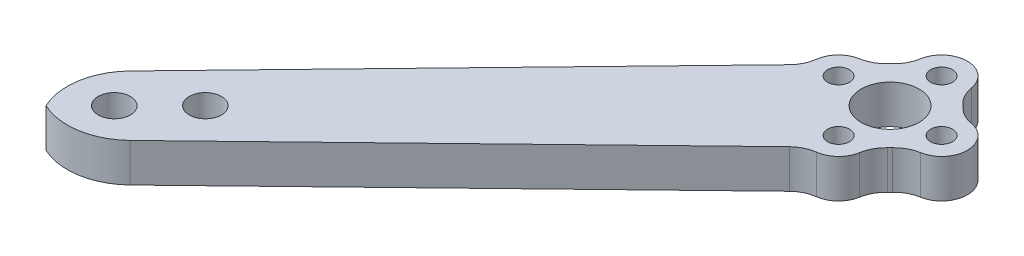
ISO-10303-21;
HEADER;
FILE_DESCRIPTION(('STEP AP214'),'2;1');
FILE_NAME('part.step','',(''),(''),'','','');
FILE_SCHEMA(('AUTOMOTIVE_DESIGN { 1 0 10303 214 1 1 1 1 }'));
ENDSEC;
DATA;
#1=APPLICATION_CONTEXT('core data for automotive mechanical design processes');
#2=APPLICATION_PROTOCOL_DEFINITION('international standard','automotive_design',2000,#1);
#3=PRODUCT_CONTEXT('',#1,'mechanical');
#4=PRODUCT('Part','Part','',(#3));
#5=PRODUCT_RELATED_PRODUCT_CATEGORY('part','',(#4));
#6=PRODUCT_DEFINITION_FORMATION('','',#4);
#7=PRODUCT_DEFINITION_CONTEXT('part definition',#1,'design');
#8=PRODUCT_DEFINITION('design','',#6,#7);
#9=PRODUCT_DEFINITION_SHAPE('','',#8);
#10=(LENGTH_UNIT() NAMED_UNIT(*) SI_UNIT(.MILLI.,.METRE.));
#11=(NAMED_UNIT(*) PLANE_ANGLE_UNIT() SI_UNIT($,.RADIAN.));
#12=(NAMED_UNIT(*) SI_UNIT($,.STERADIAN.) SOLID_ANGLE_UNIT());
#13=UNCERTAINTY_MEASURE_WITH_UNIT(LENGTH_MEASURE(1.E-05),#10,'distance_accuracy_value','');
#14=(GEOMETRIC_REPRESENTATION_CONTEXT(3) GLOBAL_UNCERTAINTY_ASSIGNED_CONTEXT((#13)) GLOBAL_UNIT_ASSIGNED_CONTEXT((#10,
#11,#12)) REPRESENTATION_CONTEXT('',''));
#15=CARTESIAN_POINT('',(0.,0.,0.));
#16=DIRECTION('',(0.,0.,1.));
#17=DIRECTION('',(1.,0.,0.));
#18=AXIS2_PLACEMENT_3D('',#15,#16,#17);
#19=CARTESIAN_POINT('',(94.5,6.,-93.8741196746495));
#20=DIRECTION('',(0.,-1.,0.));
#21=DIRECTION('',(0.,0.,-1.));
#22=AXIS2_PLACEMENT_3D('',#19,#20,#21);
#23=PLANE('',#22);
#24=CARTESIAN_POINT('',(24.7487373415292,6.,-24.7487373415292));
#25=DIRECTION('',(0.,1.,0.));
#26=DIRECTION('',(0.,0.,1.));
#27=AXIS2_PLACEMENT_3D('',#24,#25,#26);
#28=CIRCLE('',#27,2.5);
#29=CARTESIAN_POINT('',(24.7487373415292,6.,-22.2487373415292));
#30=VERTEX_POINT('',#29);
#31=EDGE_CURVE('E235',#30,#30,#28,.T.);
#32=ORIENTED_EDGE('',*,*,#31,.F.);
#33=EDGE_LOOP('',(#32));
#34=FACE_BOUND('',#33,.T.);
#35=CARTESIAN_POINT('',(31.8198051533946,6.,-31.8198051533946));
#36=DIRECTION('',(0.,1.,0.));
#37=DIRECTION('',(0.,0.,1.));
#38=AXIS2_PLACEMENT_3D('',#35,#36,#37);
#39=CIRCLE('',#38,2.5);
#40=CARTESIAN_POINT('',(31.8198051533946,6.,-29.3198051533946));
#41=VERTEX_POINT('',#40);
#42=EDGE_CURVE('E242',#41,#41,#39,.T.);
#43=ORIENTED_EDGE('',*,*,#42,.F.);
#44=EDGE_LOOP('',(#43));
#45=FACE_BOUND('',#44,.T.);
#46=CARTESIAN_POINT('',(28.4945148623447,6.,-23.6962252841413));
#47=DIRECTION('',(0.,-1.,0.));
#48=DIRECTION('',(0.,0.,-1.));
#49=AXIS2_PLACEMENT_3D('',#46,#47,#48);
#50=CIRCLE('',#49,10.);
#51=CARTESIAN_POINT('',(21.3078406424468,6.,-30.6497649336331));
#52=VERTEX_POINT('',#51);
#53=CARTESIAN_POINT('',(19.4437458895595,6.,-19.4437458895683));
#54=VERTEX_POINT('',#53);
#55=EDGE_CURVE('E65',#52,#54,#50,.F.);
#56=ORIENTED_EDGE('',*,*,#55,.T.);
#57=CARTESIAN_POINT('',(23.6962252841324,6.,-28.4945148623536));
#58=DIRECTION('',(0.,-1.,0.));
#59=DIRECTION('',(0.,0.,-1.));
#60=AXIS2_PLACEMENT_3D('',#57,#58,#59);
#61=CIRCLE('',#60,10.);
#62=CARTESIAN_POINT('',(30.6497649336229,6.,-21.3078406424544));
#63=VERTEX_POINT('',#62);
#64=EDGE_CURVE('E57',#54,#63,#61,.F.);
#65=ORIENTED_EDGE('',*,*,#64,.T.);
#66=DIRECTION('',(0.71866742198992,0.,-0.695353964949048));
#67=VECTOR('',#66,1.);
#68=CARTESIAN_POINT('',(82.7012290940619,6.,-71.6707635715978));
#69=LINE('',#68,#67);
#70=CARTESIAN_POINT('',(82.7012290940617,6.,-71.6707635715979));
#71=VERTEX_POINT('',#70);
#72=EDGE_CURVE('E312',#63,#71,#69,.T.);
#73=ORIENTED_EDGE('',*,*,#72,.T.);
#74=CARTESIAN_POINT('',(86.1779989188068,6.,-68.0774264616485));
#75=DIRECTION('',(0.,-1.,0.));
#76=DIRECTION('',(0.,0.,1.));
#77=AXIS2_PLACEMENT_3D('',#74,#75,#76);
#78=CIRCLE('',#77,4.99999999999975);
#79=CARTESIAN_POINT('',(85.5235550750253,6.,-73.0344117607327));
#80=VERTEX_POINT('',#79);
#81=EDGE_CURVE('E315',#71,#80,#78,.T.);
#82=ORIENTED_EDGE('',*,*,#81,.T.);
#83=CARTESIAN_POINT('',(85.,6.,-77.));
#84=DIRECTION('',(0.,1.,0.));
#85=DIRECTION('',(0.,0.,1.));
#86=AXIS2_PLACEMENT_3D('',#83,#84,#85);
#87=CIRCLE('',#86,4.00000000000002);
#88=CARTESIAN_POINT('',(88.9440531887331,6.,-76.3333333333334));
#89=VERTEX_POINT('',#88);
#90=EDGE_CURVE('E318',#80,#89,#87,.T.);
#91=ORIENTED_EDGE('',*,*,#90,.T.);
#92=CARTESIAN_POINT('',(93.8741196746494,6.,-75.5));
#93=DIRECTION('',(0.,-1.,0.));
#94=DIRECTION('',(0.,0.,1.));
#95=AXIS2_PLACEMENT_3D('',#92,#93,#94);
#96=CIRCLE('',#95,5.);
#97=CARTESIAN_POINT('',(90.4609967228612,6.,-79.1538461538462));
#98=VERTEX_POINT('',#97);
#99=EDGE_CURVE('E321',#89,#98,#96,.T.);
#100=ORIENTED_EDGE('',*,*,#99,.T.);
#101=CARTESIAN_POINT('',(85.,6.,-85.));
#102=DIRECTION('',(0.,1.,0.));
#103=DIRECTION('',(0.,0.,1.));
#104=AXIS2_PLACEMENT_3D('',#101,#102,#103);
#105=CIRCLE('',#104,8.);
#106=CARTESIAN_POINT('',(90.8461538461538,6.,-79.5390032771388));
#107=VERTEX_POINT('',#106);
#108=EDGE_CURVE('E324',#98,#107,#105,.T.);
#109=ORIENTED_EDGE('',*,*,#108,.T.);
#110=CARTESIAN_POINT('',(94.5,6.,-76.1258803253506));
#111=DIRECTION('',(0.,-1.,0.));
#112=DIRECTION('',(0.,0.,1.));
#113=AXIS2_PLACEMENT_3D('',#110,#111,#112);
#114=CIRCLE('',#113,5.);
#115=CARTESIAN_POINT('',(93.6666666666667,6.,-81.0559468112669));
#116=VERTEX_POINT('',#115);
#117=EDGE_CURVE('E327',#107,#116,#114,.T.);
#118=ORIENTED_EDGE('',*,*,#117,.T.);
#119=CARTESIAN_POINT('',(93.,6.,-85.));
#120=DIRECTION('',(0.,1.,0.));
#121=DIRECTION('',(0.,0.,1.));
#122=AXIS2_PLACEMENT_3D('',#119,#120,#121);
#123=CIRCLE('',#122,4.00000000000001);
#124=CARTESIAN_POINT('',(93.6666666666667,6.,-88.9440531887331));
#125=VERTEX_POINT('',#124);
#126=EDGE_CURVE('E197',#116,#125,#123,.T.);
#127=ORIENTED_EDGE('',*,*,#126,.T.);
#128=CARTESIAN_POINT('',(94.5,6.,-93.8741196746495));
#129=DIRECTION('',(0.,-1.,0.));
#130=DIRECTION('',(0.,0.,-1.));
#131=AXIS2_PLACEMENT_3D('',#128,#129,#130);
#132=CIRCLE('',#131,5.);
#133=CARTESIAN_POINT('',(90.8461538461539,6.,-90.4609967228612));
#134=VERTEX_POINT('',#133);
#135=EDGE_CURVE('E192',#125,#134,#132,.T.);
#136=ORIENTED_EDGE('',*,*,#135,.T.);
#137=CARTESIAN_POINT('',(85.,6.,-85.));
#138=DIRECTION('',(0.,1.,0.));
#139=DIRECTION('',(0.,0.,1.));
#140=AXIS2_PLACEMENT_3D('',#137,#138,#139);
#141=CIRCLE('',#140,8.);
#142=CARTESIAN_POINT('',(90.4609967228612,6.,-90.8461538461539));
#143=VERTEX_POINT('',#142);
#144=EDGE_CURVE('E181',#134,#143,#141,.T.);
#145=ORIENTED_EDGE('',*,*,#144,.T.);
#146=CARTESIAN_POINT('',(93.8741196746494,6.,-94.5));
#147=DIRECTION('',(0.,-1.,0.));
#148=DIRECTION('',(0.,0.,1.));
#149=AXIS2_PLACEMENT_3D('',#146,#147,#148);
#150=CIRCLE('',#149,5.);
#151=CARTESIAN_POINT('',(88.9440531887331,6.,-93.6666666666667));
#152=VERTEX_POINT('',#151);
#153=EDGE_CURVE('E191',#143,#152,#150,.T.);
#154=ORIENTED_EDGE('',*,*,#153,.T.);
#155=CARTESIAN_POINT('',(85.,6.,-93.));
#156=DIRECTION('',(0.,1.,0.));
#157=DIRECTION('',(0.,0.,1.));
#158=AXIS2_PLACEMENT_3D('',#155,#156,#157);
#159=CIRCLE('',#158,4.);
#160=CARTESIAN_POINT('',(81.055946811267,6.,-93.6666666666667));
#161=VERTEX_POINT('',#160);
#162=EDGE_CURVE('E291',#152,#161,#159,.T.);
#163=ORIENTED_EDGE('',*,*,#162,.T.);
#164=CARTESIAN_POINT('',(76.1258803253506,6.,-94.5));
#165=DIRECTION('',(0.,-1.,0.));
#166=DIRECTION('',(0.,0.,1.));
#167=AXIS2_PLACEMENT_3D('',#164,#165,#166);
#168=CIRCLE('',#167,5.00000000000004);
#169=CARTESIAN_POINT('',(79.5390032771388,6.,-90.8461538461539));
#170=VERTEX_POINT('',#169);
#171=EDGE_CURVE('E294',#161,#170,#168,.T.);
#172=ORIENTED_EDGE('',*,*,#171,.T.);
#173=CARTESIAN_POINT('',(85.,6.,-85.));
#174=DIRECTION('',(0.,1.,0.));
#175=DIRECTION('',(0.,0.,1.));
#176=AXIS2_PLACEMENT_3D('',#173,#174,#175);
#177=CIRCLE('',#176,7.99999999999997);
#178=CARTESIAN_POINT('',(79.1538461538461,6.,-90.4609967228609));
#179=VERTEX_POINT('',#178);
#180=EDGE_CURVE('E297',#170,#179,#177,.T.);
#181=ORIENTED_EDGE('',*,*,#180,.T.);
#182=CARTESIAN_POINT('',(75.5,6.,-93.8741196746495));
#183=DIRECTION('',(0.,-1.,0.));
#184=DIRECTION('',(0.,0.,1.));
#185=AXIS2_PLACEMENT_3D('',#182,#183,#184);
#186=CIRCLE('',#185,5.00000000000013);
#187=CARTESIAN_POINT('',(76.3333333333333,6.,-88.9440531887328));
#188=VERTEX_POINT('',#187);
#189=EDGE_CURVE('E300',#179,#188,#186,.T.);
#190=ORIENTED_EDGE('',*,*,#189,.T.);
#191=CARTESIAN_POINT('',(77.,6.,-85.));
#192=DIRECTION('',(0.,1.,0.));
#193=DIRECTION('',(0.,0.,1.));
#194=AXIS2_PLACEMENT_3D('',#191,#192,#193);
#195=CIRCLE('',#194,3.99999999999974);
#196=CARTESIAN_POINT('',(73.0344117607328,6.,-85.5235550750248));
#197=VERTEX_POINT('',#196);
#198=EDGE_CURVE('E303',#188,#197,#195,.T.);
#199=ORIENTED_EDGE('',*,*,#198,.T.);
#200=CARTESIAN_POINT('',(68.0774264616485,6.,-86.1779989188068));
#201=DIRECTION('',(0.,-1.,0.));
#202=DIRECTION('',(0.,0.,-1.));
#203=AXIS2_PLACEMENT_3D('',#200,#201,#202);
#204=CIRCLE('',#203,5.00000000000018);
#205=CARTESIAN_POINT('',(71.6707635715976,6.,-82.7012290940609));
#206=VERTEX_POINT('',#205);
#207=EDGE_CURVE('E306',#197,#206,#204,.T.);
#208=ORIENTED_EDGE('',*,*,#207,.T.);
#209=DIRECTION('',(-0.695353964949178,0.,0.718667421989795));
#210=VECTOR('',#209,1.);
#211=CARTESIAN_POINT('',(14.4680013583688,6.,-23.5806031643863));
#212=LINE('',#211,#210);
#213=EDGE_CURVE('E309',#206,#52,#212,.T.);
#214=ORIENTED_EDGE('',*,*,#213,.T.);
#215=EDGE_LOOP('',(#56,#65,#73,#82,#91,#100,#109,#118,#127,#136,#145,#154,#163,#172,#181,#190,
#199,#208,#214));
#216=FACE_BOUND('',#215,.T.);
#217=CARTESIAN_POINT('',(85.,6.,-93.));
#218=DIRECTION('',(0.,1.,0.));
#219=DIRECTION('',(0.,0.,1.));
#220=AXIS2_PLACEMENT_3D('',#217,#218,#219);
#221=CIRCLE('',#220,1.7);
#222=CARTESIAN_POINT('',(85.,6.,-91.3));
#223=VERTEX_POINT('',#222);
#224=EDGE_CURVE('E282',#223,#223,#221,.T.);
#225=ORIENTED_EDGE('',*,*,#224,.F.);
#226=EDGE_LOOP('',(#225));
#227=FACE_BOUND('',#226,.T.);
#228=CARTESIAN_POINT('',(93.,6.,-85.));
#229=DIRECTION('',(0.,1.,0.));
#230=DIRECTION('',(0.,0.,1.));
#231=AXIS2_PLACEMENT_3D('',#228,#229,#230);
#232=CIRCLE('',#231,1.7);
#233=CARTESIAN_POINT('',(93.,6.,-83.3));
#234=VERTEX_POINT('',#233);
#235=EDGE_CURVE('E274',#234,#234,#232,.T.);
#236=ORIENTED_EDGE('',*,*,#235,.F.);
#237=EDGE_LOOP('',(#236));
#238=FACE_BOUND('',#237,.T.);
#239=CARTESIAN_POINT('',(85.,6.,-77.));
#240=DIRECTION('',(0.,1.,0.));
#241=DIRECTION('',(0.,0.,1.));
#242=AXIS2_PLACEMENT_3D('',#239,#240,#241);
#243=CIRCLE('',#242,1.7);
#244=CARTESIAN_POINT('',(85.,6.,-75.3000000000001));
#245=VERTEX_POINT('',#244);
#246=EDGE_CURVE('E266',#245,#245,#243,.T.);
#247=ORIENTED_EDGE('',*,*,#246,.F.);
#248=EDGE_LOOP('',(#247));
#249=FACE_BOUND('',#248,.T.);
#250=CARTESIAN_POINT('',(77.,6.,-85.));
#251=DIRECTION('',(0.,1.,0.));
#252=DIRECTION('',(0.,0.,1.));
#253=AXIS2_PLACEMENT_3D('',#250,#251,#252);
#254=CIRCLE('',#253,1.7);
#255=CARTESIAN_POINT('',(77.,6.,-83.3));
#256=VERTEX_POINT('',#255);
#257=EDGE_CURVE('E258',#256,#256,#254,.T.);
#258=ORIENTED_EDGE('',*,*,#257,.F.);
#259=EDGE_LOOP('',(#258));
#260=FACE_BOUND('',#259,.T.);
#261=CARTESIAN_POINT('',(85.,6.,-85.));
#262=DIRECTION('',(0.,1.,0.));
#263=DIRECTION('',(0.,0.,1.));
#264=AXIS2_PLACEMENT_3D('',#261,#262,#263);
#265=CIRCLE('',#264,4.50000000000001);
#266=CARTESIAN_POINT('',(85.,6.,-80.5));
#267=VERTEX_POINT('',#266);
#268=EDGE_CURVE('E250',#267,#267,#265,.T.);
#269=ORIENTED_EDGE('',*,*,#268,.F.);
#270=EDGE_LOOP('',(#269));
#271=FACE_BOUND('',#270,.T.);
#272=ADVANCED_FACE('F47',(#34,#45,#216,#227,#238,#249,#260,#271),#23,.F.);
#273=CARTESIAN_POINT('',(94.5,0.,-93.8741196746495));
#274=DIRECTION('',(0.,-1.,0.));
#275=DIRECTION('',(0.,0.,-1.));
#276=AXIS2_PLACEMENT_3D('',#273,#274,#275);
#277=PLANE('',#276);
#278=CARTESIAN_POINT('',(24.7487373415292,0.,-24.7487373415292));
#279=DIRECTION('',(0.,-1.,0.));
#280=DIRECTION('',(0.,0.,-1.));
#281=AXIS2_PLACEMENT_3D('',#278,#279,#280);
#282=CIRCLE('',#281,2.5);
#283=CARTESIAN_POINT('',(24.7487373415292,0.,-22.2487373415292));
#284=VERTEX_POINT('',#283);
#285=EDGE_CURVE('E51',#284,#284,#282,.T.);
#286=ORIENTED_EDGE('',*,*,#285,.F.);
#287=EDGE_LOOP('',(#286));
#288=FACE_BOUND('',#287,.T.);
#289=CARTESIAN_POINT('',(31.8198051533946,0.,-31.8198051533946));
#290=DIRECTION('',(0.,-1.,0.));
#291=DIRECTION('',(0.,0.,-1.));
#292=AXIS2_PLACEMENT_3D('',#289,#290,#291);
#293=CIRCLE('',#292,2.5);
#294=CARTESIAN_POINT('',(31.8198051533946,0.,-29.3198051533946));
#295=VERTEX_POINT('',#294);
#296=EDGE_CURVE('E232',#295,#295,#293,.T.);
#297=ORIENTED_EDGE('',*,*,#296,.F.);
#298=EDGE_LOOP('',(#297));
#299=FACE_BOUND('',#298,.T.);
#300=CARTESIAN_POINT('',(77.,0.,-85.));
#301=DIRECTION('',(0.,1.,0.));
#302=DIRECTION('',(0.,0.,1.));
#303=AXIS2_PLACEMENT_3D('',#300,#301,#302);
#304=CIRCLE('',#303,1.7);
#305=CARTESIAN_POINT('',(77.,0.,-83.3));
#306=VERTEX_POINT('',#305);
#307=EDGE_CURVE('E254',#306,#306,#304,.T.);
#308=ORIENTED_EDGE('',*,*,#307,.T.);
#309=EDGE_LOOP('',(#308));
#310=FACE_BOUND('',#309,.T.);
#311=CARTESIAN_POINT('',(93.,0.,-85.));
#312=DIRECTION('',(0.,1.,0.));
#313=DIRECTION('',(0.,0.,1.));
#314=AXIS2_PLACEMENT_3D('',#311,#312,#313);
#315=CIRCLE('',#314,1.7);
#316=CARTESIAN_POINT('',(93.,0.,-83.3));
#317=VERTEX_POINT('',#316);
#318=EDGE_CURVE('E270',#317,#317,#315,.T.);
#319=ORIENTED_EDGE('',*,*,#318,.T.);
#320=EDGE_LOOP('',(#319));
#321=FACE_BOUND('',#320,.T.);
#322=DIRECTION('',(0.71866742198992,0.,-0.695353964949048));
#323=VECTOR('',#322,1.);
#324=CARTESIAN_POINT('',(82.7012290940619,0.,-71.6707635715978));
#325=LINE('',#324,#323);
#326=CARTESIAN_POINT('',(30.6497649336229,0.,-21.3078406424544));
#327=VERTEX_POINT('',#326);
#328=CARTESIAN_POINT('',(82.7012290940617,0.,-71.6707635715979));
#329=VERTEX_POINT('',#328);
#330=EDGE_CURVE('E362',#327,#329,#325,.T.);
#331=ORIENTED_EDGE('',*,*,#330,.F.);
#332=CARTESIAN_POINT('',(23.6962252841324,0.,-28.4945148623536));
#333=DIRECTION('',(0.,-1.,0.));
#334=DIRECTION('',(0.,0.,-1.));
#335=AXIS2_PLACEMENT_3D('',#332,#333,#334);
#336=CIRCLE('',#335,10.);
#337=CARTESIAN_POINT('',(19.4437458895595,0.,-19.4437458895683));
#338=VERTEX_POINT('',#337);
#339=EDGE_CURVE('E221',#327,#338,#336,.T.);
#340=ORIENTED_EDGE('',*,*,#339,.T.);
#341=CARTESIAN_POINT('',(28.4945148623447,0.,-23.6962252841413));
#342=DIRECTION('',(0.,-1.,0.));
#343=DIRECTION('',(0.,0.,-1.));
#344=AXIS2_PLACEMENT_3D('',#341,#342,#343);
#345=CIRCLE('',#344,10.);
#346=CARTESIAN_POINT('',(21.3078406424468,0.,-30.6497649336331));
#347=VERTEX_POINT('',#346);
#348=EDGE_CURVE('E213',#338,#347,#345,.T.);
#349=ORIENTED_EDGE('',*,*,#348,.T.);
#350=DIRECTION('',(-0.695353964949178,0.,0.718667421989795));
#351=VECTOR('',#350,1.);
#352=CARTESIAN_POINT('',(14.4680013583688,0.,-23.5806031643863));
#353=LINE('',#352,#351);
#354=CARTESIAN_POINT('',(71.6707635715976,0.,-82.7012290940609));
#355=VERTEX_POINT('',#354);
#356=EDGE_CURVE('E359',#355,#347,#353,.T.);
#357=ORIENTED_EDGE('',*,*,#356,.F.);
#358=CARTESIAN_POINT('',(68.0774264616485,0.,-86.1779989188068));
#359=DIRECTION('',(0.,-1.,0.));
#360=DIRECTION('',(0.,0.,-1.));
#361=AXIS2_PLACEMENT_3D('',#358,#359,#360);
#362=CIRCLE('',#361,5.00000000000018);
#363=CARTESIAN_POINT('',(73.0344117607328,0.,-85.5235550750248));
#364=VERTEX_POINT('',#363);
#365=EDGE_CURVE('E356',#364,#355,#362,.T.);
#366=ORIENTED_EDGE('',*,*,#365,.F.);
#367=CARTESIAN_POINT('',(77.,0.,-85.));
#368=DIRECTION('',(0.,1.,0.));
#369=DIRECTION('',(0.,0.,1.));
#370=AXIS2_PLACEMENT_3D('',#367,#368,#369);
#371=CIRCLE('',#370,3.99999999999974);
#372=CARTESIAN_POINT('',(76.3333333333333,0.,-88.9440531887328));
#373=VERTEX_POINT('',#372);
#374=EDGE_CURVE('E353',#373,#364,#371,.T.);
#375=ORIENTED_EDGE('',*,*,#374,.F.);
#376=CARTESIAN_POINT('',(75.5,0.,-93.8741196746495));
#377=DIRECTION('',(0.,-1.,0.));
#378=DIRECTION('',(0.,0.,1.));
#379=AXIS2_PLACEMENT_3D('',#376,#377,#378);
#380=CIRCLE('',#379,5.00000000000013);
#381=CARTESIAN_POINT('',(79.1538461538461,0.,-90.4609967228609));
#382=VERTEX_POINT('',#381);
#383=EDGE_CURVE('E350',#382,#373,#380,.T.);
#384=ORIENTED_EDGE('',*,*,#383,.F.);
#385=CARTESIAN_POINT('',(85.,0.,-85.));
#386=DIRECTION('',(0.,1.,0.));
#387=DIRECTION('',(0.,0.,1.));
#388=AXIS2_PLACEMENT_3D('',#385,#386,#387);
#389=CIRCLE('',#388,7.99999999999997);
#390=CARTESIAN_POINT('',(79.5390032771388,0.,-90.8461538461539));
#391=VERTEX_POINT('',#390);
#392=EDGE_CURVE('E347',#391,#382,#389,.T.);
#393=ORIENTED_EDGE('',*,*,#392,.F.);
#394=CARTESIAN_POINT('',(76.1258803253506,0.,-94.5));
#395=DIRECTION('',(0.,-1.,0.));
#396=DIRECTION('',(0.,0.,1.));
#397=AXIS2_PLACEMENT_3D('',#394,#395,#396);
#398=CIRCLE('',#397,5.00000000000004);
#399=CARTESIAN_POINT('',(81.055946811267,0.,-93.6666666666667));
#400=VERTEX_POINT('',#399);
#401=EDGE_CURVE('E344',#400,#391,#398,.T.);
#402=ORIENTED_EDGE('',*,*,#401,.F.);
#403=CARTESIAN_POINT('',(85.,0.,-93.));
#404=DIRECTION('',(0.,1.,0.));
#405=DIRECTION('',(0.,0.,1.));
#406=AXIS2_PLACEMENT_3D('',#403,#404,#405);
#407=CIRCLE('',#406,4.);
#408=CARTESIAN_POINT('',(88.9440531887331,0.,-93.6666666666667));
#409=VERTEX_POINT('',#408);
#410=EDGE_CURVE('E341',#409,#400,#407,.T.);
#411=ORIENTED_EDGE('',*,*,#410,.F.);
#412=CARTESIAN_POINT('',(93.8741196746494,0.,-94.5));
#413=DIRECTION('',(0.,-1.,0.));
#414=DIRECTION('',(0.,0.,1.));
#415=AXIS2_PLACEMENT_3D('',#412,#413,#414);
#416=CIRCLE('',#415,5.);
#417=CARTESIAN_POINT('',(90.4609967228612,0.,-90.8461538461539));
#418=VERTEX_POINT('',#417);
#419=EDGE_CURVE('E338',#418,#409,#416,.T.);
#420=ORIENTED_EDGE('',*,*,#419,.F.);
#421=CARTESIAN_POINT('',(85.,0.,-85.));
#422=DIRECTION('',(0.,1.,0.));
#423=DIRECTION('',(0.,0.,1.));
#424=AXIS2_PLACEMENT_3D('',#421,#422,#423);
#425=CIRCLE('',#424,8.);
#426=CARTESIAN_POINT('',(90.8461538461539,0.,-90.4609967228612));
#427=VERTEX_POINT('',#426);
#428=EDGE_CURVE('E335',#427,#418,#425,.T.);
#429=ORIENTED_EDGE('',*,*,#428,.F.);
#430=CARTESIAN_POINT('',(94.5,0.,-93.8741196746495));
#431=DIRECTION('',(0.,-1.,0.));
#432=DIRECTION('',(0.,0.,-1.));
#433=AXIS2_PLACEMENT_3D('',#430,#431,#432);
#434=CIRCLE('',#433,5.);
#435=CARTESIAN_POINT('',(93.6666666666667,0.,-88.9440531887331));
#436=VERTEX_POINT('',#435);
#437=EDGE_CURVE('E206',#436,#427,#434,.T.);
#438=ORIENTED_EDGE('',*,*,#437,.F.);
#439=CARTESIAN_POINT('',(93.,0.,-85.));
#440=DIRECTION('',(0.,1.,0.));
#441=DIRECTION('',(0.,0.,1.));
#442=AXIS2_PLACEMENT_3D('',#439,#440,#441);
#443=CIRCLE('',#442,4.00000000000001);
#444=CARTESIAN_POINT('',(93.6666666666667,0.,-81.0559468112669));
#445=VERTEX_POINT('',#444);
#446=EDGE_CURVE('E202',#445,#436,#443,.T.);
#447=ORIENTED_EDGE('',*,*,#446,.F.);
#448=CARTESIAN_POINT('',(94.5,0.,-76.1258803253506));
#449=DIRECTION('',(0.,-1.,0.));
#450=DIRECTION('',(0.,0.,1.));
#451=AXIS2_PLACEMENT_3D('',#448,#449,#450);
#452=CIRCLE('',#451,5.);
#453=CARTESIAN_POINT('',(90.8461538461538,0.,-79.5390032771388));
#454=VERTEX_POINT('',#453);
#455=EDGE_CURVE('E377',#454,#445,#452,.T.);
#456=ORIENTED_EDGE('',*,*,#455,.F.);
#457=CARTESIAN_POINT('',(85.,0.,-85.));
#458=DIRECTION('',(0.,1.,0.));
#459=DIRECTION('',(0.,0.,1.));
#460=AXIS2_PLACEMENT_3D('',#457,#458,#459);
#461=CIRCLE('',#460,8.);
#462=CARTESIAN_POINT('',(90.4609967228612,0.,-79.1538461538462));
#463=VERTEX_POINT('',#462);
#464=EDGE_CURVE('E374',#463,#454,#461,.T.);
#465=ORIENTED_EDGE('',*,*,#464,.F.);
#466=CARTESIAN_POINT('',(93.8741196746494,0.,-75.5));
#467=DIRECTION('',(0.,-1.,0.));
#468=DIRECTION('',(0.,0.,1.));
#469=AXIS2_PLACEMENT_3D('',#466,#467,#468);
#470=CIRCLE('',#469,5.);
#471=CARTESIAN_POINT('',(88.9440531887331,0.,-76.3333333333334));
#472=VERTEX_POINT('',#471);
#473=EDGE_CURVE('E371',#472,#463,#470,.T.);
#474=ORIENTED_EDGE('',*,*,#473,.F.);
#475=CARTESIAN_POINT('',(85.,0.,-77.));
#476=DIRECTION('',(0.,1.,0.));
#477=DIRECTION('',(0.,0.,1.));
#478=AXIS2_PLACEMENT_3D('',#475,#476,#477);
#479=CIRCLE('',#478,4.00000000000002);
#480=CARTESIAN_POINT('',(85.5235550750253,0.,-73.0344117607327));
#481=VERTEX_POINT('',#480);
#482=EDGE_CURVE('E368',#481,#472,#479,.T.);
#483=ORIENTED_EDGE('',*,*,#482,.F.);
#484=CARTESIAN_POINT('',(86.1779989188068,0.,-68.0774264616485));
#485=DIRECTION('',(0.,-1.,0.));
#486=DIRECTION('',(0.,0.,1.));
#487=AXIS2_PLACEMENT_3D('',#484,#485,#486);
#488=CIRCLE('',#487,4.99999999999975);
#489=EDGE_CURVE('E365',#329,#481,#488,.T.);
#490=ORIENTED_EDGE('',*,*,#489,.F.);
#491=EDGE_LOOP('',(#331,#340,#349,#357,#366,#375,#384,#393,#402,#411,#420,#429,#438,#447,#456,
#465,#474,#483,#490));
#492=FACE_BOUND('',#491,.T.);
#493=CARTESIAN_POINT('',(85.,0.,-93.));
#494=DIRECTION('',(0.,1.,0.));
#495=DIRECTION('',(0.,0.,1.));
#496=AXIS2_PLACEMENT_3D('',#493,#494,#495);
#497=CIRCLE('',#496,1.7);
#498=CARTESIAN_POINT('',(85.,0.,-91.3));
#499=VERTEX_POINT('',#498);
#500=EDGE_CURVE('E278',#499,#499,#497,.T.);
#501=ORIENTED_EDGE('',*,*,#500,.T.);
#502=EDGE_LOOP('',(#501));
#503=FACE_BOUND('',#502,.T.);
#504=CARTESIAN_POINT('',(85.,0.,-77.));
#505=DIRECTION('',(0.,1.,0.));
#506=DIRECTION('',(0.,0.,1.));
#507=AXIS2_PLACEMENT_3D('',#504,#505,#506);
#508=CIRCLE('',#507,1.7);
#509=CARTESIAN_POINT('',(85.,0.,-75.3000000000001));
#510=VERTEX_POINT('',#509);
#511=EDGE_CURVE('E262',#510,#510,#508,.T.);
#512=ORIENTED_EDGE('',*,*,#511,.T.);
#513=EDGE_LOOP('',(#512));
#514=FACE_BOUND('',#513,.T.);
#515=CARTESIAN_POINT('',(85.,0.,-85.));
#516=DIRECTION('',(0.,1.,0.));
#517=DIRECTION('',(0.,0.,1.));
#518=AXIS2_PLACEMENT_3D('',#515,#516,#517);
#519=CIRCLE('',#518,4.50000000000001);
#520=CARTESIAN_POINT('',(85.,0.,-80.5));
#521=VERTEX_POINT('',#520);
#522=EDGE_CURVE('E231',#521,#521,#519,.T.);
#523=ORIENTED_EDGE('',*,*,#522,.T.);
#524=EDGE_LOOP('',(#523));
#525=FACE_BOUND('',#524,.T.);
#526=ADVANCED_FACE('F444',(#288,#299,#310,#321,#492,#503,#514,#525),#277,.T.);
#527=CARTESIAN_POINT('',(94.5,6.,-93.8741196746495));
#528=DIRECTION('',(0.,-1.,0.));
#529=DIRECTION('',(0.,0.,-1.));
#530=AXIS2_PLACEMENT_3D('',#527,#528,#529);
#531=CYLINDRICAL_SURFACE('',#530,5.);
#532=ORIENTED_EDGE('',*,*,#437,.T.);
#533=DIRECTION('',(0.,-1.,0.));
#534=VECTOR('',#533,1.);
#535=CARTESIAN_POINT('',(90.8461538461539,6.,-90.4609967228612));
#536=LINE('',#535,#534);
#537=EDGE_CURVE('E185',#134,#427,#536,.T.);
#538=ORIENTED_EDGE('',*,*,#537,.F.);
#539=ORIENTED_EDGE('',*,*,#135,.F.);
#540=DIRECTION('',(0.,-1.,0.));
#541=VECTOR('',#540,1.);
#542=CARTESIAN_POINT('',(93.6666666666667,6.,-88.9440531887331));
#543=LINE('',#542,#541);
#544=EDGE_CURVE('E332',#125,#436,#543,.T.);
#545=ORIENTED_EDGE('',*,*,#544,.T.);
#546=EDGE_LOOP('',(#532,#538,#539,#545));
#547=FACE_BOUND('',#546,.T.);
#548=ADVANCED_FACE('F204',(#547),#531,.F.);
#549=CARTESIAN_POINT('',(85.,6.,-85.));
#550=DIRECTION('',(0.,-1.,0.));
#551=DIRECTION('',(0.,0.,-1.));
#552=AXIS2_PLACEMENT_3D('',#549,#550,#551);
#553=CYLINDRICAL_SURFACE('',#552,8.);
#554=ORIENTED_EDGE('',*,*,#428,.T.);
#555=DIRECTION('',(0.,-1.,0.));
#556=VECTOR('',#555,1.);
#557=CARTESIAN_POINT('',(90.4609967228612,6.,-90.8461538461539));
#558=LINE('',#557,#556);
#559=EDGE_CURVE('E188',#143,#418,#558,.T.);
#560=ORIENTED_EDGE('',*,*,#559,.F.);
#561=ORIENTED_EDGE('',*,*,#144,.F.);
#562=ORIENTED_EDGE('',*,*,#537,.T.);
#563=EDGE_LOOP('',(#554,#560,#561,#562));
#564=FACE_BOUND('',#563,.T.);
#565=ADVANCED_FACE('F183',(#564),#553,.T.);
#566=CARTESIAN_POINT('',(93.8741196746494,6.,-94.5));
#567=DIRECTION('',(0.,-1.,0.));
#568=DIRECTION('',(0.,0.,-1.));
#569=AXIS2_PLACEMENT_3D('',#566,#567,#568);
#570=CYLINDRICAL_SURFACE('',#569,5.);
#571=ORIENTED_EDGE('',*,*,#419,.T.);
#572=DIRECTION('',(0.,-1.,0.));
#573=VECTOR('',#572,1.);
#574=CARTESIAN_POINT('',(88.9440531887331,6.,-93.6666666666667));
#575=LINE('',#574,#573);
#576=EDGE_CURVE('E215',#152,#409,#575,.T.);
#577=ORIENTED_EDGE('',*,*,#576,.F.);
#578=ORIENTED_EDGE('',*,*,#153,.F.);
#579=ORIENTED_EDGE('',*,*,#559,.T.);
#580=EDGE_LOOP('',(#571,#577,#578,#579));
#581=FACE_BOUND('',#580,.T.);
#582=ADVANCED_FACE('F458',(#581),#570,.F.);
#583=CARTESIAN_POINT('',(85.,6.,-93.));
#584=DIRECTION('',(0.,-1.,0.));
#585=DIRECTION('',(0.,0.,-1.));
#586=AXIS2_PLACEMENT_3D('',#583,#584,#585);
#587=CYLINDRICAL_SURFACE('',#586,4.);
#588=ORIENTED_EDGE('',*,*,#410,.T.);
#589=DIRECTION('',(0.,-1.,0.));
#590=VECTOR('',#589,1.);
#591=CARTESIAN_POINT('',(81.055946811267,6.,-93.6666666666667));
#592=LINE('',#591,#590);
#593=EDGE_CURVE('E428',#161,#400,#592,.T.);
#594=ORIENTED_EDGE('',*,*,#593,.F.);
#595=ORIENTED_EDGE('',*,*,#162,.F.);
#596=ORIENTED_EDGE('',*,*,#576,.T.);
#597=EDGE_LOOP('',(#588,#594,#595,#596));
#598=FACE_BOUND('',#597,.T.);
#599=ADVANCED_FACE('F437',(#598),#587,.T.);
#600=CARTESIAN_POINT('',(76.1258803253506,6.,-94.5));
#601=DIRECTION('',(0.,-1.,0.));
#602=DIRECTION('',(0.,0.,-1.));
#603=AXIS2_PLACEMENT_3D('',#600,#601,#602);
#604=CYLINDRICAL_SURFACE('',#603,5.00000000000004);
#605=ORIENTED_EDGE('',*,*,#401,.T.);
#606=DIRECTION('',(0.,-1.,0.));
#607=VECTOR('',#606,1.);
#608=CARTESIAN_POINT('',(79.5390032771388,6.,-90.8461538461539));
#609=LINE('',#608,#607);
#610=EDGE_CURVE('E424',#170,#391,#609,.T.);
#611=ORIENTED_EDGE('',*,*,#610,.F.);
#612=ORIENTED_EDGE('',*,*,#171,.F.);
#613=ORIENTED_EDGE('',*,*,#593,.T.);
#614=EDGE_LOOP('',(#605,#611,#612,#613));
#615=FACE_BOUND('',#614,.T.);
#616=ADVANCED_FACE('F450',(#615),#604,.F.);
#617=CARTESIAN_POINT('',(85.,6.,-85.));
#618=DIRECTION('',(0.,-1.,0.));
#619=DIRECTION('',(0.,0.,-1.));
#620=AXIS2_PLACEMENT_3D('',#617,#618,#619);
#621=CYLINDRICAL_SURFACE('',#620,7.99999999999997);
#622=ORIENTED_EDGE('',*,*,#392,.T.);
#623=DIRECTION('',(0.,-1.,0.));
#624=VECTOR('',#623,1.);
#625=CARTESIAN_POINT('',(79.1538461538461,6.,-90.4609967228609));
#626=LINE('',#625,#624);
#627=EDGE_CURVE('E420',#179,#382,#626,.T.);
#628=ORIENTED_EDGE('',*,*,#627,.F.);
#629=ORIENTED_EDGE('',*,*,#180,.F.);
#630=ORIENTED_EDGE('',*,*,#610,.T.);
#631=EDGE_LOOP('',(#622,#628,#629,#630));
#632=FACE_BOUND('',#631,.T.);
#633=ADVANCED_FACE('F454',(#632),#621,.T.);
#634=CARTESIAN_POINT('',(75.5,6.,-93.8741196746495));
#635=DIRECTION('',(0.,-1.,0.));
#636=DIRECTION('',(0.,0.,-1.));
#637=AXIS2_PLACEMENT_3D('',#634,#635,#636);
#638=CYLINDRICAL_SURFACE('',#637,5.00000000000013);
#639=ORIENTED_EDGE('',*,*,#383,.T.);
#640=DIRECTION('',(0.,-1.,0.));
#641=VECTOR('',#640,1.);
#642=CARTESIAN_POINT('',(76.3333333333333,6.,-88.9440531887328));
#643=LINE('',#642,#641);
#644=EDGE_CURVE('E416',#188,#373,#643,.T.);
#645=ORIENTED_EDGE('',*,*,#644,.F.);
#646=ORIENTED_EDGE('',*,*,#189,.F.);
#647=ORIENTED_EDGE('',*,*,#627,.T.);
#648=EDGE_LOOP('',(#639,#645,#646,#647));
#649=FACE_BOUND('',#648,.T.);
#650=ADVANCED_FACE('F519',(#649),#638,.F.);
#651=CARTESIAN_POINT('',(77.,6.,-85.));
#652=DIRECTION('',(0.,-1.,0.));
#653=DIRECTION('',(0.,0.,-1.));
#654=AXIS2_PLACEMENT_3D('',#651,#652,#653);
#655=CYLINDRICAL_SURFACE('',#654,3.99999999999974);
#656=ORIENTED_EDGE('',*,*,#374,.T.);
#657=DIRECTION('',(0.,-1.,0.));
#658=VECTOR('',#657,1.);
#659=CARTESIAN_POINT('',(73.0344117607328,6.,-85.5235550750248));
#660=LINE('',#659,#658);
#661=EDGE_CURVE('E412',#197,#364,#660,.T.);
#662=ORIENTED_EDGE('',*,*,#661,.F.);
#663=ORIENTED_EDGE('',*,*,#198,.F.);
#664=ORIENTED_EDGE('',*,*,#644,.T.);
#665=EDGE_LOOP('',(#656,#662,#663,#664));
#666=FACE_BOUND('',#665,.T.);
#667=ADVANCED_FACE('F515',(#666),#655,.T.);
#668=CARTESIAN_POINT('',(68.0774264616485,6.,-86.1779989188068));
#669=DIRECTION('',(0.,-1.,0.));
#670=DIRECTION('',(0.,0.,-1.));
#671=AXIS2_PLACEMENT_3D('',#668,#669,#670);
#672=CYLINDRICAL_SURFACE('',#671,5.00000000000018);
#673=ORIENTED_EDGE('',*,*,#365,.T.);
#674=DIRECTION('',(0.,-1.,0.));
#675=VECTOR('',#674,1.);
#676=CARTESIAN_POINT('',(71.6707635715976,6.,-82.7012290940609));
#677=LINE('',#676,#675);
#678=EDGE_CURVE('E408',#206,#355,#677,.T.);
#679=ORIENTED_EDGE('',*,*,#678,.F.);
#680=ORIENTED_EDGE('',*,*,#207,.F.);
#681=ORIENTED_EDGE('',*,*,#661,.T.);
#682=EDGE_LOOP('',(#673,#679,#680,#681));
#683=FACE_BOUND('',#682,.T.);
#684=ADVANCED_FACE('F512',(#683),#672,.F.);
#685=CARTESIAN_POINT('',(14.4680013583688,6.,-23.5806031643863));
#686=DIRECTION('',(0.718667421989795,0.,0.695353964949178));
#687=DIRECTION('',(0.695353964949178,0.,-0.718667421989795));
#688=AXIS2_PLACEMENT_3D('',#685,#686,#687);
#689=PLANE('',#688);
#690=ORIENTED_EDGE('',*,*,#356,.T.);
#691=DIRECTION('',(0.,-1.,0.));
#692=VECTOR('',#691,1.);
#693=CARTESIAN_POINT('',(21.3078406424468,6.,-30.6497649336331));
#694=LINE('',#693,#692);
#695=EDGE_CURVE('E11',#347,#52,#694,.F.);
#696=ORIENTED_EDGE('',*,*,#695,.T.);
#697=ORIENTED_EDGE('',*,*,#213,.F.);
#698=ORIENTED_EDGE('',*,*,#678,.T.);
#699=EDGE_LOOP('',(#690,#696,#697,#698));
#700=FACE_BOUND('',#699,.T.);
#701=ADVANCED_FACE('F508',(#700),#689,.F.);
#702=CARTESIAN_POINT('',(82.7012290940619,6.,-71.6707635715978));
#703=DIRECTION('',(-0.695353964949048,0.,-0.71866742198992));
#704=DIRECTION('',(-0.71866742198992,0.,0.695353964949048));
#705=AXIS2_PLACEMENT_3D('',#702,#703,#704);
#706=PLANE('',#705);
#707=ORIENTED_EDGE('',*,*,#72,.F.);
#708=DIRECTION('',(0.,-1.,0.));
#709=VECTOR('',#708,1.);
#710=CARTESIAN_POINT('',(30.6497649336229,6.,-21.3078406424544));
#711=LINE('',#710,#709);
#712=EDGE_CURVE('E208',#63,#327,#711,.T.);
#713=ORIENTED_EDGE('',*,*,#712,.T.);
#714=ORIENTED_EDGE('',*,*,#330,.T.);
#715=DIRECTION('',(0.,-1.,0.));
#716=VECTOR('',#715,1.);
#717=CARTESIAN_POINT('',(82.7012290940617,6.,-71.6707635715979));
#718=LINE('',#717,#716);
#719=EDGE_CURVE('E404',#71,#329,#718,.T.);
#720=ORIENTED_EDGE('',*,*,#719,.F.);
#721=EDGE_LOOP('',(#707,#713,#714,#720));
#722=FACE_BOUND('',#721,.T.);
#723=ADVANCED_FACE('F504',(#722),#706,.F.);
#724=CARTESIAN_POINT('',(86.1779989188068,6.,-68.0774264616485));
#725=DIRECTION('',(0.,-1.,0.));
#726=DIRECTION('',(0.,0.,-1.));
#727=AXIS2_PLACEMENT_3D('',#724,#725,#726);
#728=CYLINDRICAL_SURFACE('',#727,4.99999999999975);
#729=ORIENTED_EDGE('',*,*,#489,.T.);
#730=DIRECTION('',(0.,-1.,0.));
#731=VECTOR('',#730,1.);
#732=CARTESIAN_POINT('',(85.5235550750253,6.,-73.0344117607327));
#733=LINE('',#732,#731);
#734=EDGE_CURVE('E400',#80,#481,#733,.T.);
#735=ORIENTED_EDGE('',*,*,#734,.F.);
#736=ORIENTED_EDGE('',*,*,#81,.F.);
#737=ORIENTED_EDGE('',*,*,#719,.T.);
#738=EDGE_LOOP('',(#729,#735,#736,#737));
#739=FACE_BOUND('',#738,.T.);
#740=ADVANCED_FACE('F500',(#739),#728,.F.);
#741=CARTESIAN_POINT('',(85.,6.,-77.));
#742=DIRECTION('',(0.,-1.,0.));
#743=DIRECTION('',(0.,0.,-1.));
#744=AXIS2_PLACEMENT_3D('',#741,#742,#743);
#745=CYLINDRICAL_SURFACE('',#744,4.00000000000002);
#746=ORIENTED_EDGE('',*,*,#482,.T.);
#747=DIRECTION('',(0.,-1.,0.));
#748=VECTOR('',#747,1.);
#749=CARTESIAN_POINT('',(88.9440531887331,6.,-76.3333333333334));
#750=LINE('',#749,#748);
#751=EDGE_CURVE('E396',#89,#472,#750,.T.);
#752=ORIENTED_EDGE('',*,*,#751,.F.);
#753=ORIENTED_EDGE('',*,*,#90,.F.);
#754=ORIENTED_EDGE('',*,*,#734,.T.);
#755=EDGE_LOOP('',(#746,#752,#753,#754));
#756=FACE_BOUND('',#755,.T.);
#757=ADVANCED_FACE('F496',(#756),#745,.T.);
#758=CARTESIAN_POINT('',(93.8741196746494,6.,-75.5));
#759=DIRECTION('',(0.,-1.,0.));
#760=DIRECTION('',(0.,0.,-1.));
#761=AXIS2_PLACEMENT_3D('',#758,#759,#760);
#762=CYLINDRICAL_SURFACE('',#761,5.);
#763=ORIENTED_EDGE('',*,*,#473,.T.);
#764=DIRECTION('',(0.,-1.,0.));
#765=VECTOR('',#764,1.);
#766=CARTESIAN_POINT('',(90.4609967228612,6.,-79.1538461538462));
#767=LINE('',#766,#765);
#768=EDGE_CURVE('E392',#98,#463,#767,.T.);
#769=ORIENTED_EDGE('',*,*,#768,.F.);
#770=ORIENTED_EDGE('',*,*,#99,.F.);
#771=ORIENTED_EDGE('',*,*,#751,.T.);
#772=EDGE_LOOP('',(#763,#769,#770,#771));
#773=FACE_BOUND('',#772,.T.);
#774=ADVANCED_FACE('F492',(#773),#762,.F.);
#775=CARTESIAN_POINT('',(85.,6.,-85.));
#776=DIRECTION('',(0.,-1.,0.));
#777=DIRECTION('',(0.,0.,-1.));
#778=AXIS2_PLACEMENT_3D('',#775,#776,#777);
#779=CYLINDRICAL_SURFACE('',#778,8.);
#780=ORIENTED_EDGE('',*,*,#464,.T.);
#781=DIRECTION('',(0.,-1.,0.));
#782=VECTOR('',#781,1.);
#783=CARTESIAN_POINT('',(90.8461538461538,6.,-79.5390032771388));
#784=LINE('',#783,#782);
#785=EDGE_CURVE('E388',#107,#454,#784,.T.);
#786=ORIENTED_EDGE('',*,*,#785,.F.);
#787=ORIENTED_EDGE('',*,*,#108,.F.);
#788=ORIENTED_EDGE('',*,*,#768,.T.);
#789=EDGE_LOOP('',(#780,#786,#787,#788));
#790=FACE_BOUND('',#789,.T.);
#791=ADVANCED_FACE('F488',(#790),#779,.T.);
#792=CARTESIAN_POINT('',(94.5,6.,-76.1258803253506));
#793=DIRECTION('',(0.,-1.,0.));
#794=DIRECTION('',(0.,0.,-1.));
#795=AXIS2_PLACEMENT_3D('',#792,#793,#794);
#796=CYLINDRICAL_SURFACE('',#795,5.);
#797=ORIENTED_EDGE('',*,*,#455,.T.);
#798=DIRECTION('',(0.,-1.,0.));
#799=VECTOR('',#798,1.);
#800=CARTESIAN_POINT('',(93.6666666666667,6.,-81.0559468112669));
#801=LINE('',#800,#799);
#802=EDGE_CURVE('E384',#116,#445,#801,.T.);
#803=ORIENTED_EDGE('',*,*,#802,.F.);
#804=ORIENTED_EDGE('',*,*,#117,.F.);
#805=ORIENTED_EDGE('',*,*,#785,.T.);
#806=EDGE_LOOP('',(#797,#803,#804,#805));
#807=FACE_BOUND('',#806,.T.);
#808=ADVANCED_FACE('F484',(#807),#796,.F.);
#809=CARTESIAN_POINT('',(93.,6.,-85.));
#810=DIRECTION('',(0.,-1.,0.));
#811=DIRECTION('',(0.,0.,-1.));
#812=AXIS2_PLACEMENT_3D('',#809,#810,#811);
#813=CYLINDRICAL_SURFACE('',#812,4.00000000000001);
#814=ORIENTED_EDGE('',*,*,#446,.T.);
#815=ORIENTED_EDGE('',*,*,#544,.F.);
#816=ORIENTED_EDGE('',*,*,#126,.F.);
#817=ORIENTED_EDGE('',*,*,#802,.T.);
#818=EDGE_LOOP('',(#814,#815,#816,#817));
#819=FACE_BOUND('',#818,.T.);
#820=ADVANCED_FACE('F481',(#819),#813,.T.);
#821=CARTESIAN_POINT('',(85.,6.,-93.));
#822=DIRECTION('',(0.,-1.,0.));
#823=DIRECTION('',(0.,0.,-1.));
#824=AXIS2_PLACEMENT_3D('',#821,#822,#823);
#825=CYLINDRICAL_SURFACE('',#824,1.7);
#826=ORIENTED_EDGE('',*,*,#224,.T.);
#827=EDGE_LOOP('',(#826));
#828=FACE_BOUND('',#827,.T.);
#829=ORIENTED_EDGE('',*,*,#500,.F.);
#830=EDGE_LOOP('',(#829));
#831=FACE_BOUND('',#830,.T.);
#832=ADVANCED_FACE('F478',(#828,#831),#825,.F.);
#833=CARTESIAN_POINT('',(93.,6.,-85.));
#834=DIRECTION('',(0.,-1.,0.));
#835=DIRECTION('',(0.,0.,-1.));
#836=AXIS2_PLACEMENT_3D('',#833,#834,#835);
#837=CYLINDRICAL_SURFACE('',#836,1.7);
#838=ORIENTED_EDGE('',*,*,#235,.T.);
#839=EDGE_LOOP('',(#838));
#840=FACE_BOUND('',#839,.T.);
#841=ORIENTED_EDGE('',*,*,#318,.F.);
#842=EDGE_LOOP('',(#841));
#843=FACE_BOUND('',#842,.T.);
#844=ADVANCED_FACE('F590',(#840,#843),#837,.F.);
#845=CARTESIAN_POINT('',(85.,6.,-77.));
#846=DIRECTION('',(0.,-1.,0.));
#847=DIRECTION('',(0.,0.,-1.));
#848=AXIS2_PLACEMENT_3D('',#845,#846,#847);
#849=CYLINDRICAL_SURFACE('',#848,1.7);
#850=ORIENTED_EDGE('',*,*,#246,.T.);
#851=EDGE_LOOP('',(#850));
#852=FACE_BOUND('',#851,.T.);
#853=ORIENTED_EDGE('',*,*,#511,.F.);
#854=EDGE_LOOP('',(#853));
#855=FACE_BOUND('',#854,.T.);
#856=ADVANCED_FACE('F598',(#852,#855),#849,.F.);
#857=CARTESIAN_POINT('',(77.,6.,-85.));
#858=DIRECTION('',(0.,-1.,0.));
#859=DIRECTION('',(0.,0.,-1.));
#860=AXIS2_PLACEMENT_3D('',#857,#858,#859);
#861=CYLINDRICAL_SURFACE('',#860,1.7);
#862=ORIENTED_EDGE('',*,*,#257,.T.);
#863=EDGE_LOOP('',(#862));
#864=FACE_BOUND('',#863,.T.);
#865=ORIENTED_EDGE('',*,*,#307,.F.);
#866=EDGE_LOOP('',(#865));
#867=FACE_BOUND('',#866,.T.);
#868=ADVANCED_FACE('F606',(#864,#867),#861,.F.);
#869=CARTESIAN_POINT('',(85.,6.,-85.));
#870=DIRECTION('',(0.,-1.,0.));
#871=DIRECTION('',(0.,0.,-1.));
#872=AXIS2_PLACEMENT_3D('',#869,#870,#871);
#873=CYLINDRICAL_SURFACE('',#872,4.50000000000001);
#874=ORIENTED_EDGE('',*,*,#268,.T.);
#875=EDGE_LOOP('',(#874));
#876=FACE_BOUND('',#875,.T.);
#877=ORIENTED_EDGE('',*,*,#522,.F.);
#878=EDGE_LOOP('',(#877));
#879=FACE_BOUND('',#878,.T.);
#880=ADVANCED_FACE('F615',(#876,#879),#873,.F.);
#881=CARTESIAN_POINT('',(28.4945148623447,6.,-23.6962252841413));
#882=DIRECTION('',(0.,-1.,0.));
#883=DIRECTION('',(0.,0.,-1.));
#884=AXIS2_PLACEMENT_3D('',#881,#882,#883);
#885=CYLINDRICAL_SURFACE('',#884,10.);
#886=DIRECTION('',(0.,-1.,0.));
#887=VECTOR('',#886,1.);
#888=CARTESIAN_POINT('',(19.4437458895595,3.,-19.4437458895683));
#889=LINE('',#888,#887);
#890=EDGE_CURVE('E228',#54,#338,#889,.T.);
#891=ORIENTED_EDGE('',*,*,#890,.F.);
#892=ORIENTED_EDGE('',*,*,#55,.F.);
#893=ORIENTED_EDGE('',*,*,#695,.F.);
#894=ORIENTED_EDGE('',*,*,#348,.F.);
#895=EDGE_LOOP('',(#891,#892,#893,#894));
#896=FACE_BOUND('',#895,.T.);
#897=ADVANCED_FACE('F49',(#896),#885,.T.);
#898=CARTESIAN_POINT('',(23.6962252841324,6.,-28.4945148623536));
#899=DIRECTION('',(0.,-1.,0.));
#900=DIRECTION('',(0.,0.,-1.));
#901=AXIS2_PLACEMENT_3D('',#898,#899,#900);
#902=CYLINDRICAL_SURFACE('',#901,10.);
#903=ORIENTED_EDGE('',*,*,#64,.F.);
#904=ORIENTED_EDGE('',*,*,#890,.T.);
#905=ORIENTED_EDGE('',*,*,#339,.F.);
#906=ORIENTED_EDGE('',*,*,#712,.F.);
#907=EDGE_LOOP('',(#903,#904,#905,#906));
#908=FACE_BOUND('',#907,.T.);
#909=ADVANCED_FACE('F639',(#908),#902,.T.);
#910=CARTESIAN_POINT('',(31.8198051533946,-1.2E-05,-31.8198051533946));
#911=DIRECTION('',(0.,1.,0.));
#912=DIRECTION('',(0.,0.,1.));
#913=AXIS2_PLACEMENT_3D('',#910,#911,#912);
#914=CYLINDRICAL_SURFACE('',#913,2.5);
#915=CARTESIAN_POINT('',(31.8198051533946,0.,-29.3198051533946));
#916=CARTESIAN_POINT('',(31.8198051533946,0.0624999999999999,-29.3198051533946));
#917=CARTESIAN_POINT('',(31.8198051533946,0.125,-29.3198051533946));
#918=CARTESIAN_POINT('',(31.8198051533946,0.25,-29.3198051533946));
#919=CARTESIAN_POINT('',(31.8198051533946,0.3125,-29.3198051533946));
#920=CARTESIAN_POINT('',(31.8198051533946,0.4375,-29.3198051533946));
#921=CARTESIAN_POINT('',(31.8198051533946,0.5,-29.3198051533946));
#922=CARTESIAN_POINT('',(31.8198051533946,0.625,-29.3198051533946));
#923=CARTESIAN_POINT('',(31.8198051533946,0.6875,-29.3198051533946));
#924=CARTESIAN_POINT('',(31.8198051533946,0.8125,-29.3198051533946));
#925=CARTESIAN_POINT('',(31.8198051533946,0.875,-29.3198051533946));
#926=CARTESIAN_POINT('',(31.8198051533946,1.,-29.3198051533946));
#927=CARTESIAN_POINT('',(31.8198051533946,1.0625,-29.3198051533946));
#928=CARTESIAN_POINT('',(31.8198051533946,1.1875,-29.3198051533946));
#929=CARTESIAN_POINT('',(31.8198051533946,1.25,-29.3198051533946));
#930=CARTESIAN_POINT('',(31.8198051533946,1.375,-29.3198051533946));
#931=CARTESIAN_POINT('',(31.8198051533946,1.4375,-29.3198051533946));
#932=CARTESIAN_POINT('',(31.8198051533946,1.5625,-29.3198051533946));
#933=CARTESIAN_POINT('',(31.8198051533946,1.625,-29.3198051533946));
#934=CARTESIAN_POINT('',(31.8198051533946,1.75,-29.3198051533946));
#935=CARTESIAN_POINT('',(31.8198051533946,1.8125,-29.3198051533946));
#936=CARTESIAN_POINT('',(31.8198051533946,1.9375,-29.3198051533946));
#937=CARTESIAN_POINT('',(31.8198051533946,2.,-29.3198051533946));
#938=CARTESIAN_POINT('',(31.8198051533946,2.125,-29.3198051533946));
#939=CARTESIAN_POINT('',(31.8198051533946,2.1875,-29.3198051533946));
#940=CARTESIAN_POINT('',(31.8198051533946,2.3125,-29.3198051533946));
#941=CARTESIAN_POINT('',(31.8198051533946,2.375,-29.3198051533946));
#942=CARTESIAN_POINT('',(31.8198051533946,2.5,-29.3198051533946));
#943=CARTESIAN_POINT('',(31.8198051533946,2.5625,-29.3198051533946));
#944=CARTESIAN_POINT('',(31.8198051533946,2.6875,-29.3198051533946));
#945=CARTESIAN_POINT('',(31.8198051533946,2.75,-29.3198051533946));
#946=CARTESIAN_POINT('',(31.8198051533946,2.875,-29.3198051533946));
#947=CARTESIAN_POINT('',(31.8198051533946,2.9375,-29.3198051533946));
#948=CARTESIAN_POINT('',(31.8198051533946,3.0625,-29.3198051533946));
#949=CARTESIAN_POINT('',(31.8198051533946,3.125,-29.3198051533946));
#950=CARTESIAN_POINT('',(31.8198051533946,3.25,-29.3198051533946));
#951=CARTESIAN_POINT('',(31.8198051533946,3.3125,-29.3198051533946));
#952=CARTESIAN_POINT('',(31.8198051533946,3.4375,-29.3198051533946));
#953=CARTESIAN_POINT('',(31.8198051533946,3.5,-29.3198051533946));
#954=CARTESIAN_POINT('',(31.8198051533946,3.625,-29.3198051533946));
#955=CARTESIAN_POINT('',(31.8198051533946,3.6875,-29.3198051533946));
#956=CARTESIAN_POINT('',(31.8198051533946,3.8125,-29.3198051533946));
#957=CARTESIAN_POINT('',(31.8198051533946,3.875,-29.3198051533946));
#958=CARTESIAN_POINT('',(31.8198051533946,4.,-29.3198051533946));
#959=CARTESIAN_POINT('',(31.8198051533946,4.0625,-29.3198051533946));
#960=CARTESIAN_POINT('',(31.8198051533946,4.1875,-29.3198051533946));
#961=CARTESIAN_POINT('',(31.8198051533946,4.25,-29.3198051533946));
#962=CARTESIAN_POINT('',(31.8198051533946,4.375,-29.3198051533946));
#963=CARTESIAN_POINT('',(31.8198051533946,4.4375,-29.3198051533946));
#964=CARTESIAN_POINT('',(31.8198051533946,4.5625,-29.3198051533946));
#965=CARTESIAN_POINT('',(31.8198051533946,4.625,-29.3198051533946));
#966=CARTESIAN_POINT('',(31.8198051533946,4.75,-29.3198051533946));
#967=CARTESIAN_POINT('',(31.8198051533946,4.8125,-29.3198051533946));
#968=CARTESIAN_POINT('',(31.8198051533946,4.9375,-29.3198051533946));
#969=CARTESIAN_POINT('',(31.8198051533946,5.,-29.3198051533946));
#970=CARTESIAN_POINT('',(31.8198051533946,5.125,-29.3198051533946));
#971=CARTESIAN_POINT('',(31.8198051533946,5.1875,-29.3198051533946));
#972=CARTESIAN_POINT('',(31.8198051533946,5.3125,-29.3198051533946));
#973=CARTESIAN_POINT('',(31.8198051533946,5.375,-29.3198051533946));
#974=CARTESIAN_POINT('',(31.8198051533946,5.5,-29.3198051533946));
#975=CARTESIAN_POINT('',(31.8198051533946,5.5625,-29.3198051533946));
#976=CARTESIAN_POINT('',(31.8198051533946,5.6875,-29.3198051533946));
#977=CARTESIAN_POINT('',(31.8198051533946,5.75,-29.3198051533946));
#978=CARTESIAN_POINT('',(31.8198051533946,5.875,-29.3198051533946));
#979=CARTESIAN_POINT('',(31.8198051533946,5.9375,-29.3198051533946));
#980=CARTESIAN_POINT('',(31.8198051533946,6.,-29.3198051533946));
#981=B_SPLINE_CURVE_WITH_KNOTS('',3,(#915,#916,#917,#918,#919,#920,#921,#922,#923,#924,#925,
#926,#927,#928,#929,#930,#931,#932,#933,#934,#935,#936,#937,#938,#939,#940,#941,#942,#943,#944,
#945,#946,#947,#948,#949,#950,#951,#952,#953,#954,#955,#956,#957,#958,#959,#960,#961,#962,#963,
#964,#965,#966,#967,#968,#969,#970,#971,#972,#973,#974,#975,#976,#977,#978,#979,#980),
.UNSPECIFIED.,.F.,.F.,(4,2,2,2,2,2,2,2,2,2,2,2,2,2,2,2,2,2,2,2,2,2,2,2,2,2,2,2,2,2,2,2,4),(0.,
0.1875,0.375,0.5625,0.75,0.9375,1.125,1.3125,1.5,1.6875,1.875,2.0625,2.25,2.4375,2.625,2.8125,
3.,3.1875,3.375,3.5625,3.75,3.9375,4.125,4.3125,4.5,4.6875,4.875,5.0625,5.25,5.4375,5.625,
5.8125,6.),.UNSPECIFIED.);
#982=EDGE_CURVE('BSEAM646',#295,#41,#981,.T.);
#983=ORIENTED_EDGE('',*,*,#296,.T.);
#984=ORIENTED_EDGE('',*,*,#42,.T.);
#985=ORIENTED_EDGE('',*,*,#982,.T.);
#986=ORIENTED_EDGE('',*,*,#982,.F.);
#987=EDGE_LOOP('',(#983,#985,#984,#986));
#988=FACE_BOUND('',#987,.T.);
#989=ADVANCED_FACE('F646',(#988),#914,.F.);
#990=CARTESIAN_POINT('',(24.7487373415292,-1.2E-05,-24.7487373415292));
#991=DIRECTION('',(0.,1.,0.));
#992=DIRECTION('',(0.,0.,1.));
#993=AXIS2_PLACEMENT_3D('',#990,#991,#992);
#994=CYLINDRICAL_SURFACE('',#993,2.5);
#995=CARTESIAN_POINT('',(24.7487373415292,0.,-22.2487373415292));
#996=CARTESIAN_POINT('',(24.7487373415292,0.0624999999999999,-22.2487373415292));
#997=CARTESIAN_POINT('',(24.7487373415292,0.125,-22.2487373415292));
#998=CARTESIAN_POINT('',(24.7487373415292,0.25,-22.2487373415292));
#999=CARTESIAN_POINT('',(24.7487373415292,0.3125,-22.2487373415292));
#1000=CARTESIAN_POINT('',(24.7487373415292,0.4375,-22.2487373415292));
#1001=CARTESIAN_POINT('',(24.7487373415292,0.5,-22.2487373415292));
#1002=CARTESIAN_POINT('',(24.7487373415292,0.625,-22.2487373415292));
#1003=CARTESIAN_POINT('',(24.7487373415292,0.6875,-22.2487373415292));
#1004=CARTESIAN_POINT('',(24.7487373415292,0.8125,-22.2487373415292));
#1005=CARTESIAN_POINT('',(24.7487373415292,0.875,-22.2487373415292));
#1006=CARTESIAN_POINT('',(24.7487373415292,1.,-22.2487373415292));
#1007=CARTESIAN_POINT('',(24.7487373415292,1.0625,-22.2487373415292));
#1008=CARTESIAN_POINT('',(24.7487373415292,1.1875,-22.2487373415292));
#1009=CARTESIAN_POINT('',(24.7487373415292,1.25,-22.2487373415292));
#1010=CARTESIAN_POINT('',(24.7487373415292,1.375,-22.2487373415292));
#1011=CARTESIAN_POINT('',(24.7487373415292,1.4375,-22.2487373415292));
#1012=CARTESIAN_POINT('',(24.7487373415292,1.5625,-22.2487373415292));
#1013=CARTESIAN_POINT('',(24.7487373415292,1.625,-22.2487373415292));
#1014=CARTESIAN_POINT('',(24.7487373415292,1.75,-22.2487373415292));
#1015=CARTESIAN_POINT('',(24.7487373415292,1.8125,-22.2487373415292));
#1016=CARTESIAN_POINT('',(24.7487373415292,1.9375,-22.2487373415292));
#1017=CARTESIAN_POINT('',(24.7487373415292,2.,-22.2487373415292));
#1018=CARTESIAN_POINT('',(24.7487373415292,2.125,-22.2487373415292));
#1019=CARTESIAN_POINT('',(24.7487373415292,2.1875,-22.2487373415292));
#1020=CARTESIAN_POINT('',(24.7487373415292,2.3125,-22.2487373415292));
#1021=CARTESIAN_POINT('',(24.7487373415292,2.375,-22.2487373415292));
#1022=CARTESIAN_POINT('',(24.7487373415292,2.5,-22.2487373415292));
#1023=CARTESIAN_POINT('',(24.7487373415292,2.5625,-22.2487373415292));
#1024=CARTESIAN_POINT('',(24.7487373415292,2.6875,-22.2487373415292));
#1025=CARTESIAN_POINT('',(24.7487373415292,2.75,-22.2487373415292));
#1026=CARTESIAN_POINT('',(24.7487373415292,2.875,-22.2487373415292));
#1027=CARTESIAN_POINT('',(24.7487373415292,2.9375,-22.2487373415292));
#1028=CARTESIAN_POINT('',(24.7487373415292,3.0625,-22.2487373415292));
#1029=CARTESIAN_POINT('',(24.7487373415292,3.125,-22.2487373415292));
#1030=CARTESIAN_POINT('',(24.7487373415292,3.25,-22.2487373415292));
#1031=CARTESIAN_POINT('',(24.7487373415292,3.3125,-22.2487373415292));
#1032=CARTESIAN_POINT('',(24.7487373415292,3.4375,-22.2487373415292));
#1033=CARTESIAN_POINT('',(24.7487373415292,3.5,-22.2487373415292));
#1034=CARTESIAN_POINT('',(24.7487373415292,3.625,-22.2487373415292));
#1035=CARTESIAN_POINT('',(24.7487373415292,3.6875,-22.2487373415292));
#1036=CARTESIAN_POINT('',(24.7487373415292,3.8125,-22.2487373415292));
#1037=CARTESIAN_POINT('',(24.7487373415292,3.875,-22.2487373415292));
#1038=CARTESIAN_POINT('',(24.7487373415292,4.,-22.2487373415292));
#1039=CARTESIAN_POINT('',(24.7487373415292,4.0625,-22.2487373415292));
#1040=CARTESIAN_POINT('',(24.7487373415292,4.1875,-22.2487373415292));
#1041=CARTESIAN_POINT('',(24.7487373415292,4.25,-22.2487373415292));
#1042=CARTESIAN_POINT('',(24.7487373415292,4.375,-22.2487373415292));
#1043=CARTESIAN_POINT('',(24.7487373415292,4.4375,-22.2487373415292));
#1044=CARTESIAN_POINT('',(24.7487373415292,4.5625,-22.2487373415292));
#1045=CARTESIAN_POINT('',(24.7487373415292,4.625,-22.2487373415292));
#1046=CARTESIAN_POINT('',(24.7487373415292,4.75,-22.2487373415292));
#1047=CARTESIAN_POINT('',(24.7487373415292,4.8125,-22.2487373415292));
#1048=CARTESIAN_POINT('',(24.7487373415292,4.9375,-22.2487373415292));
#1049=CARTESIAN_POINT('',(24.7487373415292,5.,-22.2487373415292));
#1050=CARTESIAN_POINT('',(24.7487373415292,5.125,-22.2487373415292));
#1051=CARTESIAN_POINT('',(24.7487373415292,5.1875,-22.2487373415292));
#1052=CARTESIAN_POINT('',(24.7487373415292,5.3125,-22.2487373415292));
#1053=CARTESIAN_POINT('',(24.7487373415292,5.375,-22.2487373415292));
#1054=CARTESIAN_POINT('',(24.7487373415292,5.5,-22.2487373415292));
#1055=CARTESIAN_POINT('',(24.7487373415292,5.5625,-22.2487373415292));
#1056=CARTESIAN_POINT('',(24.7487373415292,5.6875,-22.2487373415292));
#1057=CARTESIAN_POINT('',(24.7487373415292,5.75,-22.2487373415292));
#1058=CARTESIAN_POINT('',(24.7487373415292,5.875,-22.2487373415292));
#1059=CARTESIAN_POINT('',(24.7487373415292,5.9375,-22.2487373415292));
#1060=CARTESIAN_POINT('',(24.7487373415292,6.,-22.2487373415292));
#1061=B_SPLINE_CURVE_WITH_KNOTS('',3,(#995,#996,#997,#998,#999,#1000,#1001,#1002,#1003,#1004,
#1005,#1006,#1007,#1008,#1009,#1010,#1011,#1012,#1013,#1014,#1015,#1016,#1017,#1018,#1019,#1020,
#1021,#1022,#1023,#1024,#1025,#1026,#1027,#1028,#1029,#1030,#1031,#1032,#1033,#1034,#1035,#1036,
#1037,#1038,#1039,#1040,#1041,#1042,#1043,#1044,#1045,#1046,#1047,#1048,#1049,#1050,#1051,#1052,
#1053,#1054,#1055,#1056,#1057,#1058,#1059,#1060),.UNSPECIFIED.,.F.,.F.,(4,2,2,2,2,2,2,2,2,2,2,2,
2,2,2,2,2,2,2,2,2,2,2,2,2,2,2,2,2,2,2,2,4),(0.,0.1875,0.375,0.5625,0.75,0.9375,1.125,1.3125,1.5,
1.6875,1.875,2.0625,2.25,2.4375,2.625,2.8125,3.,3.1875,3.375,3.5625,3.75,3.9375,4.125,4.3125,
4.5,4.6875,4.875,5.0625,5.25,5.4375,5.625,5.8125,6.),.UNSPECIFIED.);
#1062=EDGE_CURVE('BSEAM658',#284,#30,#1061,.T.);
#1063=ORIENTED_EDGE('',*,*,#285,.T.);
#1064=ORIENTED_EDGE('',*,*,#31,.T.);
#1065=ORIENTED_EDGE('',*,*,#1062,.T.);
#1066=ORIENTED_EDGE('',*,*,#1062,.F.);
#1067=EDGE_LOOP('',(#1063,#1065,#1064,#1066));
#1068=FACE_BOUND('',#1067,.T.);
#1069=ADVANCED_FACE('F658',(#1068),#994,.F.);
#1070=CLOSED_SHELL('',(#272,#526,#548,#565,#582,#599,#616,#633,#650,#667,#684,#701,#723,#740,
#757,#774,#791,#808,#820,#832,#844,#856,#868,#880,#897,#909,#989,#1069));
#1071=MANIFOLD_SOLID_BREP('B2',#1070);
#1072=ADVANCED_BREP_SHAPE_REPRESENTATION('',(#18,#1071),#14);
#1073=SHAPE_DEFINITION_REPRESENTATION(#9,#1072);
ENDSEC;
END-ISO-10303-21;
